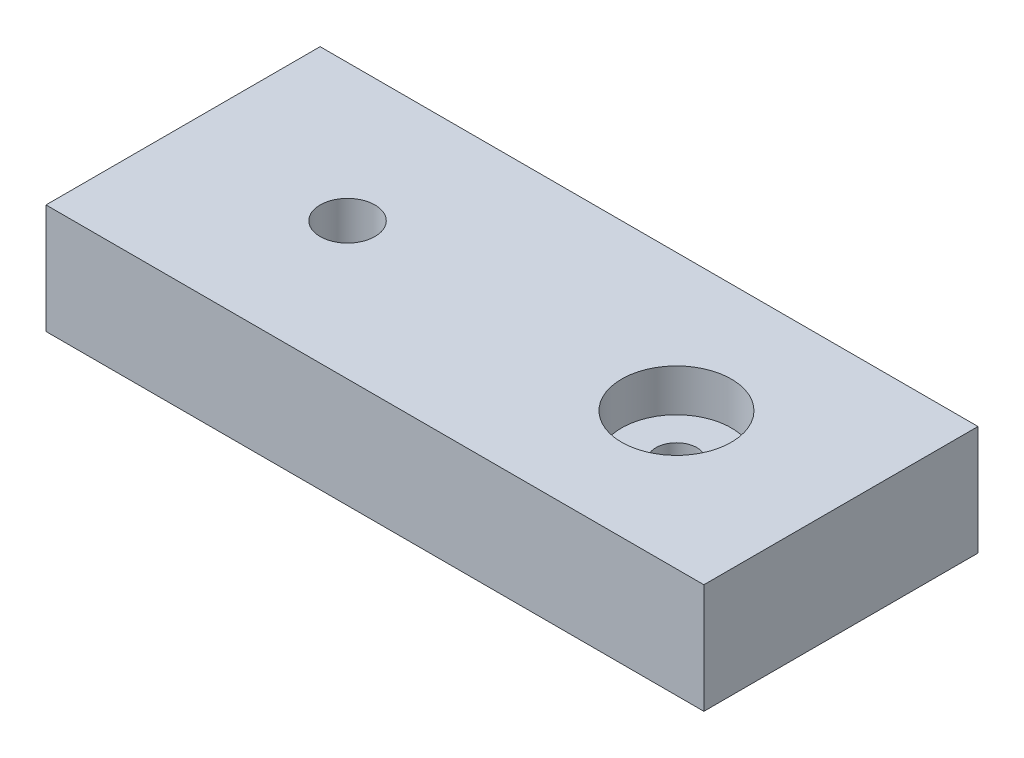
ISO-10303-21;
HEADER;
FILE_DESCRIPTION(('STEP AP214'),'2;1');
FILE_NAME('part.step','',(''),(''),'','','');
FILE_SCHEMA(('AUTOMOTIVE_DESIGN { 1 0 10303 214 1 1 1 1 }'));
ENDSEC;
DATA;
#1=APPLICATION_CONTEXT('core data for automotive mechanical design processes');
#2=APPLICATION_PROTOCOL_DEFINITION('international standard','automotive_design',2000,#1);
#3=PRODUCT_CONTEXT('',#1,'mechanical');
#4=PRODUCT('Part','Part','',(#3));
#5=PRODUCT_RELATED_PRODUCT_CATEGORY('part','',(#4));
#6=PRODUCT_DEFINITION_FORMATION('','',#4);
#7=PRODUCT_DEFINITION_CONTEXT('part definition',#1,'design');
#8=PRODUCT_DEFINITION('design','',#6,#7);
#9=PRODUCT_DEFINITION_SHAPE('','',#8);
#10=(LENGTH_UNIT() NAMED_UNIT(*) SI_UNIT(.MILLI.,.METRE.));
#11=(NAMED_UNIT(*) PLANE_ANGLE_UNIT() SI_UNIT($,.RADIAN.));
#12=(NAMED_UNIT(*) SI_UNIT($,.STERADIAN.) SOLID_ANGLE_UNIT());
#13=UNCERTAINTY_MEASURE_WITH_UNIT(LENGTH_MEASURE(1.E-05),#10,'distance_accuracy_value','');
#14=(GEOMETRIC_REPRESENTATION_CONTEXT(3) GLOBAL_UNCERTAINTY_ASSIGNED_CONTEXT((#13)) GLOBAL_UNIT_ASSIGNED_CONTEXT((#10,
#11,#12)) REPRESENTATION_CONTEXT('',''));
#15=CARTESIAN_POINT('',(0.,0.,0.));
#16=DIRECTION('',(0.,0.,1.));
#17=DIRECTION('',(1.,0.,0.));
#18=AXIS2_PLACEMENT_3D('',#15,#16,#17);
#19=CARTESIAN_POINT('',(19.05,0.,0.));
#20=DIRECTION('',(0.,1.,0.));
#21=DIRECTION('',(0.,0.,1.));
#22=AXIS2_PLACEMENT_3D('',#19,#20,#21);
#23=CYLINDRICAL_SURFACE('',#22,2.38125);
#24=CARTESIAN_POINT('',(19.05,0.,0.));
#25=DIRECTION('',(0.,1.,0.));
#26=DIRECTION('',(0.,0.,1.));
#27=AXIS2_PLACEMENT_3D('',#24,#25,#26);
#28=CIRCLE('',#27,2.38125);
#29=CARTESIAN_POINT('',(19.05,0.,2.38125));
#30=VERTEX_POINT('',#29);
#31=EDGE_CURVE('E117',#30,#30,#28,.T.);
#32=ORIENTED_EDGE('',*,*,#31,.F.);
#33=EDGE_LOOP('',(#32));
#34=FACE_BOUND('',#33,.T.);
#35=CARTESIAN_POINT('',(19.05,7.7978,0.));
#36=DIRECTION('',(0.,1.,0.));
#37=DIRECTION('',(0.,0.,1.));
#38=AXIS2_PLACEMENT_3D('',#35,#36,#37);
#39=CIRCLE('',#38,2.38125);
#40=CARTESIAN_POINT('',(19.05,7.7978,2.38125));
#41=VERTEX_POINT('',#40);
#42=EDGE_CURVE('E41',#41,#41,#39,.F.);
#43=ORIENTED_EDGE('',*,*,#42,.F.);
#44=EDGE_LOOP('',(#43));
#45=FACE_BOUND('',#44,.T.);
#46=ADVANCED_FACE('F37',(#34,#45),#23,.F.);
#47=CARTESIAN_POINT('',(38.1,12.7,15.875));
#48=DIRECTION('',(-1.,0.,0.));
#49=DIRECTION('',(0.,0.,1.));
#50=AXIS2_PLACEMENT_3D('',#47,#48,#49);
#51=PLANE('',#50);
#52=DIRECTION('',(0.,0.,-1.));
#53=VECTOR('',#52,1.);
#54=CARTESIAN_POINT('',(38.1,0.,15.875));
#55=LINE('',#54,#53);
#56=CARTESIAN_POINT('',(38.1,0.,15.875));
#57=VERTEX_POINT('',#56);
#58=CARTESIAN_POINT('',(38.1,0.,-15.875));
#59=VERTEX_POINT('',#58);
#60=EDGE_CURVE('E103',#57,#59,#55,.T.);
#61=ORIENTED_EDGE('',*,*,#60,.T.);
#62=DIRECTION('',(0.,-1.,0.));
#63=VECTOR('',#62,1.);
#64=CARTESIAN_POINT('',(38.1,12.7,-15.875));
#65=LINE('',#64,#63);
#66=CARTESIAN_POINT('',(38.1,12.7,-15.875));
#67=VERTEX_POINT('',#66);
#68=EDGE_CURVE('E11',#67,#59,#65,.T.);
#69=ORIENTED_EDGE('',*,*,#68,.F.);
#70=DIRECTION('',(0.,0.,-1.));
#71=VECTOR('',#70,1.);
#72=CARTESIAN_POINT('',(38.1,12.7,15.875));
#73=LINE('',#72,#71);
#74=CARTESIAN_POINT('',(38.1,12.7,15.875));
#75=VERTEX_POINT('',#74);
#76=EDGE_CURVE('E90',#75,#67,#73,.T.);
#77=ORIENTED_EDGE('',*,*,#76,.F.);
#78=DIRECTION('',(0.,-1.,0.));
#79=VECTOR('',#78,1.);
#80=CARTESIAN_POINT('',(38.1,12.7,15.875));
#81=LINE('',#80,#79);
#82=EDGE_CURVE('E99',#75,#57,#81,.T.);
#83=ORIENTED_EDGE('',*,*,#82,.T.);
#84=EDGE_LOOP('',(#61,#69,#77,#83));
#85=FACE_BOUND('',#84,.T.);
#86=ADVANCED_FACE('F39',(#85),#51,.F.);
#87=CARTESIAN_POINT('',(-38.1,12.7,-15.875));
#88=DIRECTION('',(0.,0.,1.));
#89=DIRECTION('',(1.,0.,0.));
#90=AXIS2_PLACEMENT_3D('',#87,#88,#89);
#91=PLANE('',#90);
#92=DIRECTION('',(-1.,0.,0.));
#93=VECTOR('',#92,1.);
#94=CARTESIAN_POINT('',(-38.1,0.,-15.875));
#95=LINE('',#94,#93);
#96=CARTESIAN_POINT('',(-38.1,0.,-15.875));
#97=VERTEX_POINT('',#96);
#98=EDGE_CURVE('E94',#59,#97,#95,.T.);
#99=ORIENTED_EDGE('',*,*,#98,.T.);
#100=DIRECTION('',(0.,-1.,0.));
#101=VECTOR('',#100,1.);
#102=CARTESIAN_POINT('',(-38.1,12.7,-15.875));
#103=LINE('',#102,#101);
#104=CARTESIAN_POINT('',(-38.1,12.7,-15.875));
#105=VERTEX_POINT('',#104);
#106=EDGE_CURVE('E47',#105,#97,#103,.T.);
#107=ORIENTED_EDGE('',*,*,#106,.F.);
#108=DIRECTION('',(-1.,0.,0.));
#109=VECTOR('',#108,1.);
#110=CARTESIAN_POINT('',(-38.1,12.7,-15.875));
#111=LINE('',#110,#109);
#112=EDGE_CURVE('E85',#67,#105,#111,.T.);
#113=ORIENTED_EDGE('',*,*,#112,.F.);
#114=ORIENTED_EDGE('',*,*,#68,.T.);
#115=EDGE_LOOP('',(#99,#107,#113,#114));
#116=FACE_BOUND('',#115,.T.);
#117=ADVANCED_FACE('F93',(#116),#91,.F.);
#118=CARTESIAN_POINT('',(-38.1,12.7,15.875));
#119=DIRECTION('',(1.,0.,0.));
#120=DIRECTION('',(0.,0.,-1.));
#121=AXIS2_PLACEMENT_3D('',#118,#119,#120);
#122=PLANE('',#121);
#123=DIRECTION('',(0.,0.,1.));
#124=VECTOR('',#123,1.);
#125=CARTESIAN_POINT('',(-38.1,0.,15.875));
#126=LINE('',#125,#124);
#127=CARTESIAN_POINT('',(-38.1,0.,15.875));
#128=VERTEX_POINT('',#127);
#129=EDGE_CURVE('E72',#97,#128,#126,.T.);
#130=ORIENTED_EDGE('',*,*,#129,.T.);
#131=DIRECTION('',(0.,-1.,0.));
#132=VECTOR('',#131,1.);
#133=CARTESIAN_POINT('',(-38.1,12.7,15.875));
#134=LINE('',#133,#132);
#135=CARTESIAN_POINT('',(-38.1,12.7,15.875));
#136=VERTEX_POINT('',#135);
#137=EDGE_CURVE('E95',#136,#128,#134,.T.);
#138=ORIENTED_EDGE('',*,*,#137,.F.);
#139=DIRECTION('',(0.,0.,1.));
#140=VECTOR('',#139,1.);
#141=CARTESIAN_POINT('',(-38.1,12.7,15.875));
#142=LINE('',#141,#140);
#143=EDGE_CURVE('E88',#105,#136,#142,.T.);
#144=ORIENTED_EDGE('',*,*,#143,.F.);
#145=ORIENTED_EDGE('',*,*,#106,.T.);
#146=EDGE_LOOP('',(#130,#138,#144,#145));
#147=FACE_BOUND('',#146,.T.);
#148=ADVANCED_FACE('F97',(#147),#122,.F.);
#149=CARTESIAN_POINT('',(-38.1,12.7,15.875));
#150=DIRECTION('',(0.,0.,-1.));
#151=DIRECTION('',(-1.,0.,0.));
#152=AXIS2_PLACEMENT_3D('',#149,#150,#151);
#153=PLANE('',#152);
#154=DIRECTION('',(1.,0.,0.));
#155=VECTOR('',#154,1.);
#156=CARTESIAN_POINT('',(-38.1,0.,15.875));
#157=LINE('',#156,#155);
#158=EDGE_CURVE('E78',#128,#57,#157,.T.);
#159=ORIENTED_EDGE('',*,*,#158,.T.);
#160=ORIENTED_EDGE('',*,*,#82,.F.);
#161=DIRECTION('',(1.,0.,0.));
#162=VECTOR('',#161,1.);
#163=CARTESIAN_POINT('',(-38.1,12.7,15.875));
#164=LINE('',#163,#162);
#165=EDGE_CURVE('E55',#136,#75,#164,.T.);
#166=ORIENTED_EDGE('',*,*,#165,.F.);
#167=ORIENTED_EDGE('',*,*,#137,.T.);
#168=EDGE_LOOP('',(#159,#160,#166,#167));
#169=FACE_BOUND('',#168,.T.);
#170=ADVANCED_FACE('F111',(#169),#153,.F.);
#171=CARTESIAN_POINT('',(0.,12.7,0.));
#172=DIRECTION('',(0.,-1.,0.));
#173=DIRECTION('',(0.,0.,-1.));
#174=AXIS2_PLACEMENT_3D('',#171,#172,#173);
#175=PLANE('',#174);
#176=CARTESIAN_POINT('',(19.05,12.7,0.));
#177=DIRECTION('',(0.,1.,0.));
#178=DIRECTION('',(0.,0.,1.));
#179=AXIS2_PLACEMENT_3D('',#176,#177,#178);
#180=CIRCLE('',#179,6.35);
#181=CARTESIAN_POINT('',(19.05,12.7,6.35));
#182=VERTEX_POINT('',#181);
#183=EDGE_CURVE('E125',#182,#182,#180,.T.);
#184=ORIENTED_EDGE('',*,*,#183,.F.);
#185=EDGE_LOOP('',(#184));
#186=FACE_BOUND('',#185,.T.);
#187=CARTESIAN_POINT('',(-19.05,12.7,0.));
#188=DIRECTION('',(0.,1.,0.));
#189=DIRECTION('',(0.,0.,1.));
#190=AXIS2_PLACEMENT_3D('',#187,#188,#189);
#191=CIRCLE('',#190,3.175);
#192=CARTESIAN_POINT('',(-19.05,12.7,3.175));
#193=VERTEX_POINT('',#192);
#194=EDGE_CURVE('E120',#193,#193,#191,.T.);
#195=ORIENTED_EDGE('',*,*,#194,.F.);
#196=EDGE_LOOP('',(#195));
#197=FACE_BOUND('',#196,.T.);
#198=ORIENTED_EDGE('',*,*,#76,.T.);
#199=ORIENTED_EDGE('',*,*,#112,.T.);
#200=ORIENTED_EDGE('',*,*,#143,.T.);
#201=ORIENTED_EDGE('',*,*,#165,.T.);
#202=EDGE_LOOP('',(#198,#199,#200,#201));
#203=FACE_BOUND('',#202,.T.);
#204=ADVANCED_FACE('F86',(#186,#197,#203),#175,.F.);
#205=CARTESIAN_POINT('',(0.,0.,0.));
#206=DIRECTION('',(0.,-1.,0.));
#207=DIRECTION('',(0.,0.,-1.));
#208=AXIS2_PLACEMENT_3D('',#205,#206,#207);
#209=PLANE('',#208);
#210=CARTESIAN_POINT('',(-19.05,0.,0.));
#211=DIRECTION('',(0.,1.,0.));
#212=DIRECTION('',(0.,0.,1.));
#213=AXIS2_PLACEMENT_3D('',#210,#211,#212);
#214=CIRCLE('',#213,3.175);
#215=CARTESIAN_POINT('',(-19.05,0.,3.175));
#216=VERTEX_POINT('',#215);
#217=EDGE_CURVE('E106',#216,#216,#214,.T.);
#218=ORIENTED_EDGE('',*,*,#217,.T.);
#219=EDGE_LOOP('',(#218));
#220=FACE_BOUND('',#219,.T.);
#221=ORIENTED_EDGE('',*,*,#31,.T.);
#222=EDGE_LOOP('',(#221));
#223=FACE_BOUND('',#222,.T.);
#224=ORIENTED_EDGE('',*,*,#60,.F.);
#225=ORIENTED_EDGE('',*,*,#158,.F.);
#226=ORIENTED_EDGE('',*,*,#129,.F.);
#227=ORIENTED_EDGE('',*,*,#98,.F.);
#228=EDGE_LOOP('',(#224,#225,#226,#227));
#229=FACE_BOUND('',#228,.T.);
#230=ADVANCED_FACE('F114',(#220,#223,#229),#209,.T.);
#231=CARTESIAN_POINT('',(-19.05,0.,0.));
#232=DIRECTION('',(0.,1.,0.));
#233=DIRECTION('',(0.,0.,1.));
#234=AXIS2_PLACEMENT_3D('',#231,#232,#233);
#235=CYLINDRICAL_SURFACE('',#234,3.175);
#236=ORIENTED_EDGE('',*,*,#217,.F.);
#237=EDGE_LOOP('',(#236));
#238=FACE_BOUND('',#237,.T.);
#239=ORIENTED_EDGE('',*,*,#194,.T.);
#240=EDGE_LOOP('',(#239));
#241=FACE_BOUND('',#240,.T.);
#242=ADVANCED_FACE('F146',(#238,#241),#235,.F.);
#243=CARTESIAN_POINT('',(19.05,7.7978,0.));
#244=DIRECTION('',(0.,1.,0.));
#245=DIRECTION('',(0.,0.,1.));
#246=AXIS2_PLACEMENT_3D('',#243,#244,#245);
#247=PLANE('',#246);
#248=CARTESIAN_POINT('',(19.05,7.7978,0.));
#249=DIRECTION('',(0.,1.,0.));
#250=DIRECTION('',(0.,0.,1.));
#251=AXIS2_PLACEMENT_3D('',#248,#249,#250);
#252=CIRCLE('',#251,6.35);
#253=CARTESIAN_POINT('',(19.05,7.7978,6.35));
#254=VERTEX_POINT('',#253);
#255=EDGE_CURVE('E128',#254,#254,#252,.T.);
#256=ORIENTED_EDGE('',*,*,#255,.T.);
#257=EDGE_LOOP('',(#256));
#258=FACE_BOUND('',#257,.T.);
#259=ORIENTED_EDGE('',*,*,#42,.T.);
#260=EDGE_LOOP('',(#259));
#261=FACE_BOUND('',#260,.T.);
#262=ADVANCED_FACE('F135',(#258,#261),#247,.T.);
#263=CARTESIAN_POINT('',(19.05,7.7978,0.));
#264=DIRECTION('',(0.,1.,0.));
#265=DIRECTION('',(0.,0.,1.));
#266=AXIS2_PLACEMENT_3D('',#263,#264,#265);
#267=CYLINDRICAL_SURFACE('',#266,6.35);
#268=ORIENTED_EDGE('',*,*,#255,.F.);
#269=EDGE_LOOP('',(#268));
#270=FACE_BOUND('',#269,.T.);
#271=ORIENTED_EDGE('',*,*,#183,.T.);
#272=EDGE_LOOP('',(#271));
#273=FACE_BOUND('',#272,.T.);
#274=ADVANCED_FACE('F190',(#270,#273),#267,.F.);
#275=CLOSED_SHELL('',(#46,#86,#117,#148,#170,#204,#230,#242,#262,#274));
#276=MANIFOLD_SOLID_BREP('B2',#275);
#277=ADVANCED_BREP_SHAPE_REPRESENTATION('',(#18,#276),#14);
#278=SHAPE_DEFINITION_REPRESENTATION(#9,#277);
ENDSEC;
END-ISO-10303-21;
